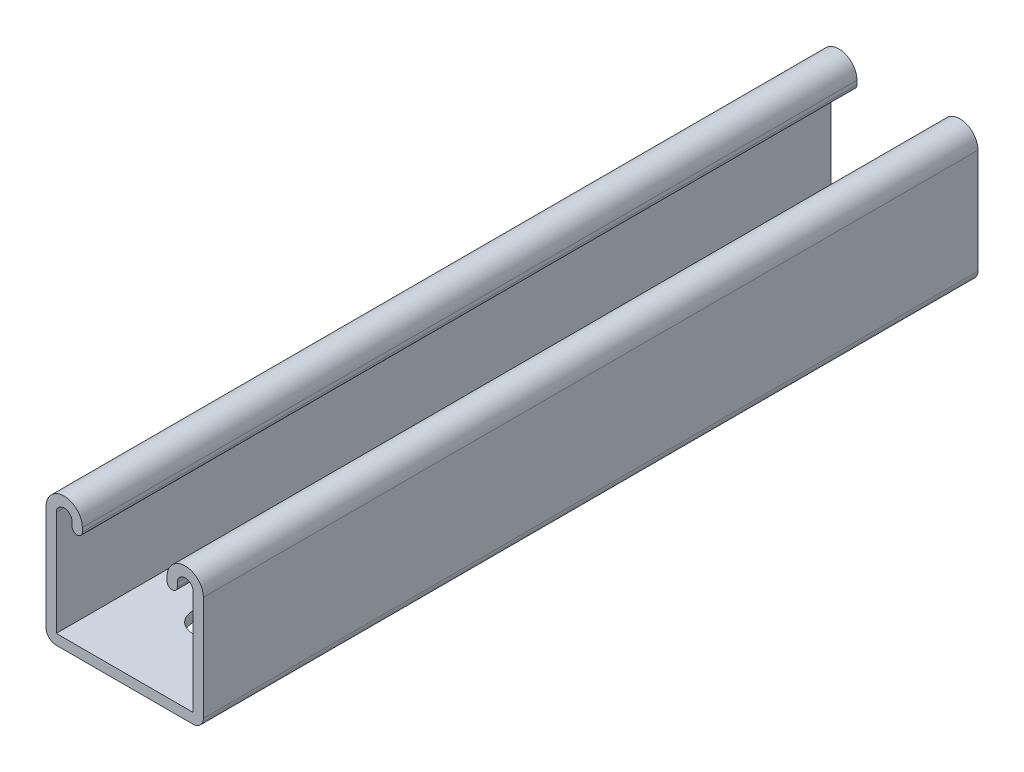
ISO-10303-21;
HEADER;
FILE_DESCRIPTION(('STEP AP214'),'2;1');
FILE_NAME('part.step','',(''),(''),'','','');
FILE_SCHEMA(('AUTOMOTIVE_DESIGN { 1 0 10303 214 1 1 1 1 }'));
ENDSEC;
DATA;
#1=APPLICATION_CONTEXT('core data for automotive mechanical design processes');
#2=APPLICATION_PROTOCOL_DEFINITION('international standard','automotive_design',2000,#1);
#3=PRODUCT_CONTEXT('',#1,'mechanical');
#4=PRODUCT('Part','Part','',(#3));
#5=PRODUCT_RELATED_PRODUCT_CATEGORY('part','',(#4));
#6=PRODUCT_DEFINITION_FORMATION('','',#4);
#7=PRODUCT_DEFINITION_CONTEXT('part definition',#1,'design');
#8=PRODUCT_DEFINITION('design','',#6,#7);
#9=PRODUCT_DEFINITION_SHAPE('','',#8);
#10=(LENGTH_UNIT() NAMED_UNIT(*) SI_UNIT(.MILLI.,.METRE.));
#11=(NAMED_UNIT(*) PLANE_ANGLE_UNIT() SI_UNIT($,.RADIAN.));
#12=(NAMED_UNIT(*) SI_UNIT($,.STERADIAN.) SOLID_ANGLE_UNIT());
#13=UNCERTAINTY_MEASURE_WITH_UNIT(LENGTH_MEASURE(1.E-05),#10,'distance_accuracy_value','');
#14=(GEOMETRIC_REPRESENTATION_CONTEXT(3) GLOBAL_UNCERTAINTY_ASSIGNED_CONTEXT((#13)) GLOBAL_UNIT_ASSIGNED_CONTEXT((#10,
#11,#12)) REPRESENTATION_CONTEXT('',''));
#15=CARTESIAN_POINT('',(0.,0.,0.));
#16=DIRECTION('',(0.,0.,1.));
#17=DIRECTION('',(1.,0.,0.));
#18=AXIS2_PLACEMENT_3D('',#15,#16,#17);
#19=CARTESIAN_POINT('',(-15.875,15.1511,203.2));
#20=DIRECTION('',(0.,0.,-1.));
#21=DIRECTION('',(-1.,0.,0.));
#22=AXIS2_PLACEMENT_3D('',#19,#20,#21);
#23=CYLINDRICAL_SURFACE('',#22,4.7625);
#24=CARTESIAN_POINT('',(-15.875,15.1511,0.));
#25=DIRECTION('',(0.,0.,1.));
#26=DIRECTION('',(-1.,0.,0.));
#27=AXIS2_PLACEMENT_3D('',#24,#25,#26);
#28=CIRCLE('',#27,4.7625);
#29=CARTESIAN_POINT('',(-11.1125,15.1511,0.));
#30=VERTEX_POINT('',#29);
#31=CARTESIAN_POINT('',(-20.6375,15.1511,0.));
#32=VERTEX_POINT('',#31);
#33=EDGE_CURVE('E253',#30,#32,#28,.T.);
#34=ORIENTED_EDGE('',*,*,#33,.T.);
#35=DIRECTION('',(0.,0.,-1.));
#36=VECTOR('',#35,1.);
#37=CARTESIAN_POINT('',(-20.6375,15.1511,203.2));
#38=LINE('',#37,#36);
#39=CARTESIAN_POINT('',(-20.6375,15.1511,203.2));
#40=VERTEX_POINT('',#39);
#41=EDGE_CURVE('E384',#40,#32,#38,.T.);
#42=ORIENTED_EDGE('',*,*,#41,.F.);
#43=CARTESIAN_POINT('',(-15.875,15.1511,203.2));
#44=DIRECTION('',(0.,0.,1.));
#45=DIRECTION('',(-1.,0.,0.));
#46=AXIS2_PLACEMENT_3D('',#43,#44,#45);
#47=CIRCLE('',#46,4.7625);
#48=CARTESIAN_POINT('',(-11.1125,15.1511,203.2));
#49=VERTEX_POINT('',#48);
#50=EDGE_CURVE('E260',#49,#40,#47,.T.);
#51=ORIENTED_EDGE('',*,*,#50,.F.);
#52=DIRECTION('',(0.,0.,-1.));
#53=VECTOR('',#52,1.);
#54=CARTESIAN_POINT('',(-11.1125,15.1511,203.2));
#55=LINE('',#54,#53);
#56=EDGE_CURVE('E298',#49,#30,#55,.T.);
#57=ORIENTED_EDGE('',*,*,#56,.T.);
#58=EDGE_LOOP('',(#34,#42,#51,#57));
#59=FACE_BOUND('',#58,.T.);
#60=ADVANCED_FACE('F32',(#59),#23,.T.);
#61=CARTESIAN_POINT('',(-20.6375,15.1511,203.2));
#62=DIRECTION('',(1.,0.,0.));
#63=DIRECTION('',(0.,1.,0.));
#64=AXIS2_PLACEMENT_3D('',#61,#62,#63);
#65=PLANE('',#64);
#66=DIRECTION('',(0.,-1.,0.));
#67=VECTOR('',#66,1.);
#68=CARTESIAN_POINT('',(-20.6375,15.1511,0.));
#69=LINE('',#68,#67);
#70=CARTESIAN_POINT('',(-20.6375,-12.319,0.));
#71=VERTEX_POINT('',#70);
#72=EDGE_CURVE('E301',#32,#71,#69,.T.);
#73=ORIENTED_EDGE('',*,*,#72,.T.);
#74=DIRECTION('',(0.,0.,-1.));
#75=VECTOR('',#74,1.);
#76=CARTESIAN_POINT('',(-20.6375,-12.319,203.2));
#77=LINE('',#76,#75);
#78=CARTESIAN_POINT('',(-20.6375,-12.319,203.2));
#79=VERTEX_POINT('',#78);
#80=EDGE_CURVE('E381',#79,#71,#77,.T.);
#81=ORIENTED_EDGE('',*,*,#80,.F.);
#82=DIRECTION('',(0.,-1.,0.));
#83=VECTOR('',#82,1.);
#84=CARTESIAN_POINT('',(-20.6375,15.1511,203.2));
#85=LINE('',#84,#83);
#86=EDGE_CURVE('E263',#40,#79,#85,.T.);
#87=ORIENTED_EDGE('',*,*,#86,.F.);
#88=ORIENTED_EDGE('',*,*,#41,.T.);
#89=EDGE_LOOP('',(#73,#81,#87,#88));
#90=FACE_BOUND('',#89,.T.);
#91=ADVANCED_FACE('F425',(#90),#65,.F.);
#92=CARTESIAN_POINT('',(-17.9451,-12.319,203.2));
#93=DIRECTION('',(0.,0.,-1.));
#94=DIRECTION('',(-1.,0.,0.));
#95=AXIS2_PLACEMENT_3D('',#92,#93,#94);
#96=CYLINDRICAL_SURFACE('',#95,2.6924);
#97=CARTESIAN_POINT('',(-17.9451,-12.319,0.));
#98=DIRECTION('',(0.,0.,1.));
#99=DIRECTION('',(-1.,0.,0.));
#100=AXIS2_PLACEMENT_3D('',#97,#98,#99);
#101=CIRCLE('',#100,2.6924);
#102=CARTESIAN_POINT('',(-17.9451,-15.0114,0.));
#103=VERTEX_POINT('',#102);
#104=EDGE_CURVE('E303',#71,#103,#101,.T.);
#105=ORIENTED_EDGE('',*,*,#104,.T.);
#106=DIRECTION('',(0.,0.,-1.));
#107=VECTOR('',#106,1.);
#108=CARTESIAN_POINT('',(-17.9451,-15.0114,203.2));
#109=LINE('',#108,#107);
#110=CARTESIAN_POINT('',(-17.9451,-15.0114,203.2));
#111=VERTEX_POINT('',#110);
#112=EDGE_CURVE('E378',#111,#103,#109,.T.);
#113=ORIENTED_EDGE('',*,*,#112,.F.);
#114=CARTESIAN_POINT('',(-17.9451,-12.319,203.2));
#115=DIRECTION('',(0.,0.,1.));
#116=DIRECTION('',(-1.,0.,0.));
#117=AXIS2_PLACEMENT_3D('',#114,#115,#116);
#118=CIRCLE('',#117,2.6924);
#119=EDGE_CURVE('E266',#79,#111,#118,.T.);
#120=ORIENTED_EDGE('',*,*,#119,.F.);
#121=ORIENTED_EDGE('',*,*,#80,.T.);
#122=EDGE_LOOP('',(#105,#113,#120,#121));
#123=FACE_BOUND('',#122,.T.);
#124=ADVANCED_FACE('F430',(#123),#96,.T.);
#125=CARTESIAN_POINT('',(-17.9451,-15.0114,203.2));
#126=DIRECTION('',(0.,1.,0.));
#127=DIRECTION('',(-1.,0.,0.));
#128=AXIS2_PLACEMENT_3D('',#125,#126,#127);
#129=PLANE('',#128);
#130=DIRECTION('',(0.,0.,-1.));
#131=VECTOR('',#130,1.);
#132=CARTESIAN_POINT('',(-5.159375,-15.0113999999917,114.3));
#133=LINE('',#132,#131);
#134=CARTESIAN_POINT('',(-5.15937500000001,-15.0114,180.18125));
#135=VERTEX_POINT('',#134);
#136=CARTESIAN_POINT('',(-5.159375,-15.0113999999917,114.3));
#137=VERTEX_POINT('',#136);
#138=EDGE_CURVE('E206',#135,#137,#133,.T.);
#139=ORIENTED_EDGE('',*,*,#138,.F.);
#140=CARTESIAN_POINT('',(0.,-15.0113999999917,180.18125));
#141=DIRECTION('',(0.,-1.,0.));
#142=DIRECTION('',(1.,0.,0.));
#143=AXIS2_PLACEMENT_3D('',#140,#141,#142);
#144=CIRCLE('',#143,5.159375);
#145=CARTESIAN_POINT('',(5.159375,-15.0113999999917,180.18125));
#146=VERTEX_POINT('',#145);
#147=EDGE_CURVE('E46',#146,#135,#144,.T.);
#148=ORIENTED_EDGE('',*,*,#147,.F.);
#149=DIRECTION('',(0.,0.,1.));
#150=VECTOR('',#149,1.);
#151=CARTESIAN_POINT('',(5.159375,-15.0113999999917,180.18125));
#152=LINE('',#151,#150);
#153=CARTESIAN_POINT('',(5.159375,-15.0113999999917,114.3));
#154=VERTEX_POINT('',#153);
#155=EDGE_CURVE('E222',#154,#146,#152,.T.);
#156=ORIENTED_EDGE('',*,*,#155,.F.);
#157=CARTESIAN_POINT('',(0.,-15.0113999999917,114.3));
#158=DIRECTION('',(0.,-1.,0.));
#159=DIRECTION('',(1.,0.,0.));
#160=AXIS2_PLACEMENT_3D('',#157,#158,#159);
#161=CIRCLE('',#160,5.159375);
#162=EDGE_CURVE('E216',#137,#154,#161,.T.);
#163=ORIENTED_EDGE('',*,*,#162,.F.);
#164=EDGE_LOOP('',(#139,#148,#156,#163));
#165=FACE_BOUND('',#164,.T.);
#166=DIRECTION('',(0.,0.,-1.));
#167=VECTOR('',#166,1.);
#168=CARTESIAN_POINT('',(-5.159375,-15.0113999999917,12.7));
#169=LINE('',#168,#167);
#170=CARTESIAN_POINT('',(-5.15937500000001,-15.0114,78.58125));
#171=VERTEX_POINT('',#170);
#172=CARTESIAN_POINT('',(-5.159375,-15.0113999999917,12.7));
#173=VERTEX_POINT('',#172);
#174=EDGE_CURVE('E241',#171,#173,#169,.T.);
#175=ORIENTED_EDGE('',*,*,#174,.F.);
#176=CARTESIAN_POINT('',(0.,-15.0113999999917,78.58125));
#177=DIRECTION('',(0.,-1.,0.));
#178=DIRECTION('',(1.,0.,0.));
#179=AXIS2_PLACEMENT_3D('',#176,#177,#178);
#180=CIRCLE('',#179,5.159375);
#181=CARTESIAN_POINT('',(5.159375,-15.0113999999917,78.58125));
#182=VERTEX_POINT('',#181);
#183=EDGE_CURVE('E239',#182,#171,#180,.T.);
#184=ORIENTED_EDGE('',*,*,#183,.F.);
#185=DIRECTION('',(0.,0.,1.));
#186=VECTOR('',#185,1.);
#187=CARTESIAN_POINT('',(5.159375,-15.0113999999917,78.58125));
#188=LINE('',#187,#186);
#189=CARTESIAN_POINT('',(5.159375,-15.0113999999917,12.7));
#190=VERTEX_POINT('',#189);
#191=EDGE_CURVE('E247',#190,#182,#188,.T.);
#192=ORIENTED_EDGE('',*,*,#191,.F.);
#193=CARTESIAN_POINT('',(0.,-15.0113999999917,12.7));
#194=DIRECTION('',(0.,-1.,0.));
#195=DIRECTION('',(1.,0.,0.));
#196=AXIS2_PLACEMENT_3D('',#193,#194,#195);
#197=CIRCLE('',#196,5.159375);
#198=EDGE_CURVE('E244',#173,#190,#197,.T.);
#199=ORIENTED_EDGE('',*,*,#198,.F.);
#200=EDGE_LOOP('',(#175,#184,#192,#199));
#201=FACE_BOUND('',#200,.T.);
#202=DIRECTION('',(1.,0.,0.));
#203=VECTOR('',#202,1.);
#204=CARTESIAN_POINT('',(-17.9451,-15.0114,0.));
#205=LINE('',#204,#203);
#206=CARTESIAN_POINT('',(17.9451,-15.0114,0.));
#207=VERTEX_POINT('',#206);
#208=EDGE_CURVE('E305',#103,#207,#205,.T.);
#209=ORIENTED_EDGE('',*,*,#208,.T.);
#210=DIRECTION('',(0.,0.,-1.));
#211=VECTOR('',#210,1.);
#212=CARTESIAN_POINT('',(17.9451,-15.0114,203.2));
#213=LINE('',#212,#211);
#214=CARTESIAN_POINT('',(17.9451,-15.0114,203.2));
#215=VERTEX_POINT('',#214);
#216=EDGE_CURVE('E375',#215,#207,#213,.T.);
#217=ORIENTED_EDGE('',*,*,#216,.F.);
#218=DIRECTION('',(1.,0.,0.));
#219=VECTOR('',#218,1.);
#220=CARTESIAN_POINT('',(-17.9451,-15.0114,203.2));
#221=LINE('',#220,#219);
#222=EDGE_CURVE('E268',#111,#215,#221,.T.);
#223=ORIENTED_EDGE('',*,*,#222,.F.);
#224=ORIENTED_EDGE('',*,*,#112,.T.);
#225=EDGE_LOOP('',(#209,#217,#223,#224));
#226=FACE_BOUND('',#225,.T.);
#227=ADVANCED_FACE('F220',(#165,#201,#226),#129,.F.);
#228=CARTESIAN_POINT('',(17.9451,-12.319,203.2));
#229=DIRECTION('',(0.,0.,-1.));
#230=DIRECTION('',(-1.,0.,0.));
#231=AXIS2_PLACEMENT_3D('',#228,#229,#230);
#232=CYLINDRICAL_SURFACE('',#231,2.6924);
#233=CARTESIAN_POINT('',(17.9451,-12.319,0.));
#234=DIRECTION('',(0.,0.,1.));
#235=DIRECTION('',(1.,0.,0.));
#236=AXIS2_PLACEMENT_3D('',#233,#234,#235);
#237=CIRCLE('',#236,2.6924);
#238=CARTESIAN_POINT('',(20.6375,-12.319,0.));
#239=VERTEX_POINT('',#238);
#240=EDGE_CURVE('E307',#207,#239,#237,.T.);
#241=ORIENTED_EDGE('',*,*,#240,.T.);
#242=DIRECTION('',(0.,0.,-1.));
#243=VECTOR('',#242,1.);
#244=CARTESIAN_POINT('',(20.6375,-12.319,203.2));
#245=LINE('',#244,#243);
#246=CARTESIAN_POINT('',(20.6375,-12.319,203.2));
#247=VERTEX_POINT('',#246);
#248=EDGE_CURVE('E372',#247,#239,#245,.T.);
#249=ORIENTED_EDGE('',*,*,#248,.F.);
#250=CARTESIAN_POINT('',(17.9451,-12.319,203.2));
#251=DIRECTION('',(0.,0.,1.));
#252=DIRECTION('',(1.,0.,0.));
#253=AXIS2_PLACEMENT_3D('',#250,#251,#252);
#254=CIRCLE('',#253,2.6924);
#255=EDGE_CURVE('E270',#215,#247,#254,.T.);
#256=ORIENTED_EDGE('',*,*,#255,.F.);
#257=ORIENTED_EDGE('',*,*,#216,.T.);
#258=EDGE_LOOP('',(#241,#249,#256,#257));
#259=FACE_BOUND('',#258,.T.);
#260=ADVANCED_FACE('F510',(#259),#232,.T.);
#261=CARTESIAN_POINT('',(20.6375,-12.319,203.2));
#262=DIRECTION('',(-1.,0.,0.));
#263=DIRECTION('',(0.,0.,1.));
#264=AXIS2_PLACEMENT_3D('',#261,#262,#263);
#265=PLANE('',#264);
#266=DIRECTION('',(0.,1.,0.));
#267=VECTOR('',#266,1.);
#268=CARTESIAN_POINT('',(20.6375,-12.319,0.));
#269=LINE('',#268,#267);
#270=CARTESIAN_POINT('',(20.6375,15.1511,0.));
#271=VERTEX_POINT('',#270);
#272=EDGE_CURVE('E309',#239,#271,#269,.T.);
#273=ORIENTED_EDGE('',*,*,#272,.T.);
#274=DIRECTION('',(0.,0.,-1.));
#275=VECTOR('',#274,1.);
#276=CARTESIAN_POINT('',(20.6375,15.1511,203.2));
#277=LINE('',#276,#275);
#278=CARTESIAN_POINT('',(20.6375,15.1511,203.2));
#279=VERTEX_POINT('',#278);
#280=EDGE_CURVE('E369',#279,#271,#277,.T.);
#281=ORIENTED_EDGE('',*,*,#280,.F.);
#282=DIRECTION('',(0.,1.,0.));
#283=VECTOR('',#282,1.);
#284=CARTESIAN_POINT('',(20.6375,-12.319,203.2));
#285=LINE('',#284,#283);
#286=EDGE_CURVE('E272',#247,#279,#285,.T.);
#287=ORIENTED_EDGE('',*,*,#286,.F.);
#288=ORIENTED_EDGE('',*,*,#248,.T.);
#289=EDGE_LOOP('',(#273,#281,#287,#288));
#290=FACE_BOUND('',#289,.T.);
#291=ADVANCED_FACE('F506',(#290),#265,.F.);
#292=CARTESIAN_POINT('',(15.875,15.1511,203.2));
#293=DIRECTION('',(0.,0.,-1.));
#294=DIRECTION('',(-1.,0.,0.));
#295=AXIS2_PLACEMENT_3D('',#292,#293,#294);
#296=CYLINDRICAL_SURFACE('',#295,4.7625);
#297=CARTESIAN_POINT('',(15.875,15.1511,0.));
#298=DIRECTION('',(0.,0.,1.));
#299=DIRECTION('',(1.,0.,0.));
#300=AXIS2_PLACEMENT_3D('',#297,#298,#299);
#301=CIRCLE('',#300,4.7625);
#302=CARTESIAN_POINT('',(11.1125,15.1511,0.));
#303=VERTEX_POINT('',#302);
#304=EDGE_CURVE('E311',#271,#303,#301,.T.);
#305=ORIENTED_EDGE('',*,*,#304,.T.);
#306=DIRECTION('',(0.,0.,-1.));
#307=VECTOR('',#306,1.);
#308=CARTESIAN_POINT('',(11.1125,15.1511,203.2));
#309=LINE('',#308,#307);
#310=CARTESIAN_POINT('',(11.1125,15.1511,203.2));
#311=VERTEX_POINT('',#310);
#312=EDGE_CURVE('E366',#311,#303,#309,.T.);
#313=ORIENTED_EDGE('',*,*,#312,.F.);
#314=CARTESIAN_POINT('',(15.875,15.1511,203.2));
#315=DIRECTION('',(0.,0.,1.));
#316=DIRECTION('',(1.,0.,0.));
#317=AXIS2_PLACEMENT_3D('',#314,#315,#316);
#318=CIRCLE('',#317,4.7625);
#319=EDGE_CURVE('E274',#279,#311,#318,.T.);
#320=ORIENTED_EDGE('',*,*,#319,.F.);
#321=ORIENTED_EDGE('',*,*,#280,.T.);
#322=EDGE_LOOP('',(#305,#313,#320,#321));
#323=FACE_BOUND('',#322,.T.);
#324=ADVANCED_FACE('F501',(#323),#296,.T.);
#325=CARTESIAN_POINT('',(11.1125,15.1511,203.2));
#326=DIRECTION('',(1.,0.,0.));
#327=DIRECTION('',(0.,1.,0.));
#328=AXIS2_PLACEMENT_3D('',#325,#326,#327);
#329=PLANE('',#328);
#330=DIRECTION('',(0.,-1.,0.));
#331=VECTOR('',#330,1.);
#332=CARTESIAN_POINT('',(11.1125,15.1511,0.));
#333=LINE('',#332,#331);
#334=CARTESIAN_POINT('',(11.1125,14.11605,0.));
#335=VERTEX_POINT('',#334);
#336=EDGE_CURVE('E313',#303,#335,#333,.T.);
#337=ORIENTED_EDGE('',*,*,#336,.T.);
#338=DIRECTION('',(0.,0.,-1.));
#339=VECTOR('',#338,1.);
#340=CARTESIAN_POINT('',(11.1125,14.11605,203.2));
#341=LINE('',#340,#339);
#342=CARTESIAN_POINT('',(11.1125,14.11605,203.2));
#343=VERTEX_POINT('',#342);
#344=EDGE_CURVE('E363',#343,#335,#341,.T.);
#345=ORIENTED_EDGE('',*,*,#344,.F.);
#346=DIRECTION('',(0.,-1.,0.));
#347=VECTOR('',#346,1.);
#348=CARTESIAN_POINT('',(11.1125,15.1511,203.2));
#349=LINE('',#348,#347);
#350=EDGE_CURVE('E276',#311,#343,#349,.T.);
#351=ORIENTED_EDGE('',*,*,#350,.F.);
#352=ORIENTED_EDGE('',*,*,#312,.T.);
#353=EDGE_LOOP('',(#337,#345,#351,#352));
#354=FACE_BOUND('',#353,.T.);
#355=ADVANCED_FACE('F495',(#354),#329,.F.);
#356=CARTESIAN_POINT('',(12.4587,14.11605,203.2));
#357=DIRECTION('',(0.,0.,-1.));
#358=DIRECTION('',(-1.,0.,0.));
#359=AXIS2_PLACEMENT_3D('',#356,#357,#358);
#360=CYLINDRICAL_SURFACE('',#359,1.3462);
#361=CARTESIAN_POINT('',(12.4587,14.11605,0.));
#362=DIRECTION('',(0.,0.,1.));
#363=DIRECTION('',(1.,0.,0.));
#364=AXIS2_PLACEMENT_3D('',#361,#362,#363);
#365=CIRCLE('',#364,1.3462);
#366=CARTESIAN_POINT('',(13.8049,14.11605,0.));
#367=VERTEX_POINT('',#366);
#368=EDGE_CURVE('E315',#335,#367,#365,.T.);
#369=ORIENTED_EDGE('',*,*,#368,.T.);
#370=DIRECTION('',(0.,0.,-1.));
#371=VECTOR('',#370,1.);
#372=CARTESIAN_POINT('',(13.8049,14.11605,203.2));
#373=LINE('',#372,#371);
#374=CARTESIAN_POINT('',(13.8049,14.11605,203.2));
#375=VERTEX_POINT('',#374);
#376=EDGE_CURVE('E360',#375,#367,#373,.T.);
#377=ORIENTED_EDGE('',*,*,#376,.F.);
#378=CARTESIAN_POINT('',(12.4587,14.11605,203.2));
#379=DIRECTION('',(0.,0.,1.));
#380=DIRECTION('',(1.,0.,0.));
#381=AXIS2_PLACEMENT_3D('',#378,#379,#380);
#382=CIRCLE('',#381,1.3462);
#383=EDGE_CURVE('E278',#343,#375,#382,.T.);
#384=ORIENTED_EDGE('',*,*,#383,.F.);
#385=ORIENTED_EDGE('',*,*,#344,.T.);
#386=EDGE_LOOP('',(#369,#377,#384,#385));
#387=FACE_BOUND('',#386,.T.);
#388=ADVANCED_FACE('F491',(#387),#360,.T.);
#389=CARTESIAN_POINT('',(13.8049,15.1511,203.2));
#390=DIRECTION('',(-1.,0.,0.));
#391=DIRECTION('',(0.,0.,1.));
#392=AXIS2_PLACEMENT_3D('',#389,#390,#391);
#393=PLANE('',#392);
#394=DIRECTION('',(0.,1.,0.));
#395=VECTOR('',#394,1.);
#396=CARTESIAN_POINT('',(13.8049,15.1511,0.));
#397=LINE('',#396,#395);
#398=CARTESIAN_POINT('',(13.8049,15.1511,0.));
#399=VERTEX_POINT('',#398);
#400=EDGE_CURVE('E317',#367,#399,#397,.T.);
#401=ORIENTED_EDGE('',*,*,#400,.T.);
#402=DIRECTION('',(0.,0.,-1.));
#403=VECTOR('',#402,1.);
#404=CARTESIAN_POINT('',(13.8049,15.1511,203.2));
#405=LINE('',#404,#403);
#406=CARTESIAN_POINT('',(13.8049,15.1511,203.2));
#407=VERTEX_POINT('',#406);
#408=EDGE_CURVE('E357',#407,#399,#405,.T.);
#409=ORIENTED_EDGE('',*,*,#408,.F.);
#410=DIRECTION('',(0.,1.,0.));
#411=VECTOR('',#410,1.);
#412=CARTESIAN_POINT('',(13.8049,15.1511,203.2));
#413=LINE('',#412,#411);
#414=EDGE_CURVE('E280',#375,#407,#413,.T.);
#415=ORIENTED_EDGE('',*,*,#414,.F.);
#416=ORIENTED_EDGE('',*,*,#376,.T.);
#417=EDGE_LOOP('',(#401,#409,#415,#416));
#418=FACE_BOUND('',#417,.T.);
#419=ADVANCED_FACE('F486',(#418),#393,.F.);
#420=CARTESIAN_POINT('',(15.875,15.1511,203.2));
#421=DIRECTION('',(0.,0.,-1.));
#422=DIRECTION('',(-1.,0.,0.));
#423=AXIS2_PLACEMENT_3D('',#420,#421,#422);
#424=CYLINDRICAL_SURFACE('',#423,2.0701);
#425=CARTESIAN_POINT('',(15.875,15.1511,0.));
#426=DIRECTION('',(0.,0.,-1.));
#427=DIRECTION('',(1.,0.,0.));
#428=AXIS2_PLACEMENT_3D('',#425,#426,#427);
#429=CIRCLE('',#428,2.0701);
#430=CARTESIAN_POINT('',(17.9451,15.1511,0.));
#431=VERTEX_POINT('',#430);
#432=EDGE_CURVE('E319',#399,#431,#429,.T.);
#433=ORIENTED_EDGE('',*,*,#432,.T.);
#434=DIRECTION('',(0.,0.,-1.));
#435=VECTOR('',#434,1.);
#436=CARTESIAN_POINT('',(17.9451,15.1511,203.2));
#437=LINE('',#436,#435);
#438=CARTESIAN_POINT('',(17.9451,15.1511,203.2));
#439=VERTEX_POINT('',#438);
#440=EDGE_CURVE('E354',#439,#431,#437,.T.);
#441=ORIENTED_EDGE('',*,*,#440,.F.);
#442=CARTESIAN_POINT('',(15.875,15.1511,203.2));
#443=DIRECTION('',(0.,0.,-1.));
#444=DIRECTION('',(1.,0.,0.));
#445=AXIS2_PLACEMENT_3D('',#442,#443,#444);
#446=CIRCLE('',#445,2.0701);
#447=EDGE_CURVE('E282',#407,#439,#446,.T.);
#448=ORIENTED_EDGE('',*,*,#447,.F.);
#449=ORIENTED_EDGE('',*,*,#408,.T.);
#450=EDGE_LOOP('',(#433,#441,#448,#449));
#451=FACE_BOUND('',#450,.T.);
#452=ADVANCED_FACE('F480',(#451),#424,.F.);
#453=CARTESIAN_POINT('',(17.9451,-12.319,203.2));
#454=DIRECTION('',(1.,0.,0.));
#455=DIRECTION('',(0.,1.,0.));
#456=AXIS2_PLACEMENT_3D('',#453,#454,#455);
#457=PLANE('',#456);
#458=DIRECTION('',(0.,-1.,0.));
#459=VECTOR('',#458,1.);
#460=CARTESIAN_POINT('',(17.9451,-12.319,0.));
#461=LINE('',#460,#459);
#462=CARTESIAN_POINT('',(17.9451,-12.319,0.));
#463=VERTEX_POINT('',#462);
#464=EDGE_CURVE('E321',#431,#463,#461,.T.);
#465=ORIENTED_EDGE('',*,*,#464,.T.);
#466=DIRECTION('',(0.,0.,-1.));
#467=VECTOR('',#466,1.);
#468=CARTESIAN_POINT('',(17.9451,-12.319,203.2));
#469=LINE('',#468,#467);
#470=CARTESIAN_POINT('',(17.9451,-12.319,203.2));
#471=VERTEX_POINT('',#470);
#472=EDGE_CURVE('E351',#471,#463,#469,.T.);
#473=ORIENTED_EDGE('',*,*,#472,.F.);
#474=DIRECTION('',(0.,-1.,0.));
#475=VECTOR('',#474,1.);
#476=CARTESIAN_POINT('',(17.9451,-12.319,203.2));
#477=LINE('',#476,#475);
#478=EDGE_CURVE('E284',#439,#471,#477,.T.);
#479=ORIENTED_EDGE('',*,*,#478,.F.);
#480=ORIENTED_EDGE('',*,*,#440,.T.);
#481=EDGE_LOOP('',(#465,#473,#479,#480));
#482=FACE_BOUND('',#481,.T.);
#483=ADVANCED_FACE('F476',(#482),#457,.F.);
#484=CARTESIAN_POINT('',(-17.9451,-12.319,203.2));
#485=DIRECTION('',(0.,-1.,0.));
#486=DIRECTION('',(0.,0.,-1.));
#487=AXIS2_PLACEMENT_3D('',#484,#485,#486);
#488=PLANE('',#487);
#489=DIRECTION('',(0.,0.,1.));
#490=VECTOR('',#489,1.);
#491=CARTESIAN_POINT('',(5.15937499999999,-12.319,304.8));
#492=LINE('',#491,#490);
#493=CARTESIAN_POINT('',(5.159375,-12.319,114.3));
#494=VERTEX_POINT('',#493);
#495=CARTESIAN_POINT('',(5.159375,-12.319,180.18125));
#496=VERTEX_POINT('',#495);
#497=EDGE_CURVE('E232',#494,#496,#492,.T.);
#498=ORIENTED_EDGE('',*,*,#497,.T.);
#499=CARTESIAN_POINT('',(0.,-12.319,180.18125));
#500=DIRECTION('',(0.,-1.,0.));
#501=DIRECTION('',(0.,0.,-1.));
#502=AXIS2_PLACEMENT_3D('',#499,#500,#501);
#503=CIRCLE('',#502,5.159375);
#504=CARTESIAN_POINT('',(-5.15937500000001,-12.319,180.18125));
#505=VERTEX_POINT('',#504);
#506=EDGE_CURVE('E236',#496,#505,#503,.T.);
#507=ORIENTED_EDGE('',*,*,#506,.T.);
#508=DIRECTION('',(0.,0.,-1.));
#509=VECTOR('',#508,1.);
#510=CARTESIAN_POINT('',(-5.15937500000002,-12.319,304.8));
#511=LINE('',#510,#509);
#512=CARTESIAN_POINT('',(-5.159375,-12.319,114.3));
#513=VERTEX_POINT('',#512);
#514=EDGE_CURVE('E213',#505,#513,#511,.T.);
#515=ORIENTED_EDGE('',*,*,#514,.T.);
#516=CARTESIAN_POINT('',(0.,-12.319,114.3));
#517=DIRECTION('',(0.,-1.,0.));
#518=DIRECTION('',(0.,0.,-1.));
#519=AXIS2_PLACEMENT_3D('',#516,#517,#518);
#520=CIRCLE('',#519,5.159375);
#521=EDGE_CURVE('E54',#513,#494,#520,.T.);
#522=ORIENTED_EDGE('',*,*,#521,.T.);
#523=EDGE_LOOP('',(#498,#507,#515,#522));
#524=FACE_BOUND('',#523,.T.);
#525=DIRECTION('',(0.,0.,1.));
#526=VECTOR('',#525,1.);
#527=CARTESIAN_POINT('',(5.15937499999999,-12.319,203.2));
#528=LINE('',#527,#526);
#529=CARTESIAN_POINT('',(5.159375,-12.319,12.7));
#530=VERTEX_POINT('',#529);
#531=CARTESIAN_POINT('',(5.159375,-12.319,78.58125));
#532=VERTEX_POINT('',#531);
#533=EDGE_CURVE('E39',#530,#532,#528,.T.);
#534=ORIENTED_EDGE('',*,*,#533,.T.);
#535=CARTESIAN_POINT('',(0.,-12.319,78.58125));
#536=DIRECTION('',(0.,-1.,0.));
#537=DIRECTION('',(0.,0.,-1.));
#538=AXIS2_PLACEMENT_3D('',#535,#536,#537);
#539=CIRCLE('',#538,5.159375);
#540=CARTESIAN_POINT('',(-5.15937500000001,-12.319,78.58125));
#541=VERTEX_POINT('',#540);
#542=EDGE_CURVE('E11',#532,#541,#539,.T.);
#543=ORIENTED_EDGE('',*,*,#542,.T.);
#544=DIRECTION('',(0.,0.,-1.));
#545=VECTOR('',#544,1.);
#546=CARTESIAN_POINT('',(-5.15937500000002,-12.319,203.2));
#547=LINE('',#546,#545);
#548=CARTESIAN_POINT('',(-5.159375,-12.319,12.7));
#549=VERTEX_POINT('',#548);
#550=EDGE_CURVE('E387',#541,#549,#547,.T.);
#551=ORIENTED_EDGE('',*,*,#550,.T.);
#552=CARTESIAN_POINT('',(0.,-12.319,12.7));
#553=DIRECTION('',(0.,-1.,0.));
#554=DIRECTION('',(0.,0.,-1.));
#555=AXIS2_PLACEMENT_3D('',#552,#553,#554);
#556=CIRCLE('',#555,5.159375);
#557=EDGE_CURVE('E390',#549,#530,#556,.T.);
#558=ORIENTED_EDGE('',*,*,#557,.T.);
#559=EDGE_LOOP('',(#534,#543,#551,#558));
#560=FACE_BOUND('',#559,.T.);
#561=DIRECTION('',(-1.,0.,0.));
#562=VECTOR('',#561,1.);
#563=CARTESIAN_POINT('',(-17.9451,-12.319,0.));
#564=LINE('',#563,#562);
#565=CARTESIAN_POINT('',(-17.9451,-12.319,0.));
#566=VERTEX_POINT('',#565);
#567=EDGE_CURVE('E323',#463,#566,#564,.T.);
#568=ORIENTED_EDGE('',*,*,#567,.T.);
#569=DIRECTION('',(0.,0.,-1.));
#570=VECTOR('',#569,1.);
#571=CARTESIAN_POINT('',(-17.9451,-12.319,203.2));
#572=LINE('',#571,#570);
#573=CARTESIAN_POINT('',(-17.9451,-12.319,203.2));
#574=VERTEX_POINT('',#573);
#575=EDGE_CURVE('E348',#574,#566,#572,.T.);
#576=ORIENTED_EDGE('',*,*,#575,.F.);
#577=DIRECTION('',(-1.,0.,0.));
#578=VECTOR('',#577,1.);
#579=CARTESIAN_POINT('',(-17.9451,-12.319,203.2));
#580=LINE('',#579,#578);
#581=EDGE_CURVE('E286',#471,#574,#580,.T.);
#582=ORIENTED_EDGE('',*,*,#581,.F.);
#583=ORIENTED_EDGE('',*,*,#472,.T.);
#584=EDGE_LOOP('',(#568,#576,#582,#583));
#585=FACE_BOUND('',#584,.T.);
#586=ADVANCED_FACE('F394',(#524,#560,#585),#488,.F.);
#587=CARTESIAN_POINT('',(-17.9451,15.1511,203.2));
#588=DIRECTION('',(-1.,0.,0.));
#589=DIRECTION('',(0.,0.,1.));
#590=AXIS2_PLACEMENT_3D('',#587,#588,#589);
#591=PLANE('',#590);
#592=DIRECTION('',(0.,1.,0.));
#593=VECTOR('',#592,1.);
#594=CARTESIAN_POINT('',(-17.9451,15.1511,0.));
#595=LINE('',#594,#593);
#596=CARTESIAN_POINT('',(-17.9451,15.1511,0.));
#597=VERTEX_POINT('',#596);
#598=EDGE_CURVE('E325',#566,#597,#595,.T.);
#599=ORIENTED_EDGE('',*,*,#598,.T.);
#600=DIRECTION('',(0.,0.,-1.));
#601=VECTOR('',#600,1.);
#602=CARTESIAN_POINT('',(-17.9451,15.1511,203.2));
#603=LINE('',#602,#601);
#604=CARTESIAN_POINT('',(-17.9451,15.1511,203.2));
#605=VERTEX_POINT('',#604);
#606=EDGE_CURVE('E345',#605,#597,#603,.T.);
#607=ORIENTED_EDGE('',*,*,#606,.F.);
#608=DIRECTION('',(0.,1.,0.));
#609=VECTOR('',#608,1.);
#610=CARTESIAN_POINT('',(-17.9451,15.1511,203.2));
#611=LINE('',#610,#609);
#612=EDGE_CURVE('E288',#574,#605,#611,.T.);
#613=ORIENTED_EDGE('',*,*,#612,.F.);
#614=ORIENTED_EDGE('',*,*,#575,.T.);
#615=EDGE_LOOP('',(#599,#607,#613,#614));
#616=FACE_BOUND('',#615,.T.);
#617=ADVANCED_FACE('F467',(#616),#591,.F.);
#618=CARTESIAN_POINT('',(-15.875,15.1511,203.2));
#619=DIRECTION('',(0.,0.,-1.));
#620=DIRECTION('',(-1.,0.,0.));
#621=AXIS2_PLACEMENT_3D('',#618,#619,#620);
#622=CYLINDRICAL_SURFACE('',#621,2.0701);
#623=CARTESIAN_POINT('',(-15.875,15.1511,0.));
#624=DIRECTION('',(0.,0.,-1.));
#625=DIRECTION('',(-1.,0.,0.));
#626=AXIS2_PLACEMENT_3D('',#623,#624,#625);
#627=CIRCLE('',#626,2.0701);
#628=CARTESIAN_POINT('',(-13.8049,15.1511,0.));
#629=VERTEX_POINT('',#628);
#630=EDGE_CURVE('E327',#597,#629,#627,.T.);
#631=ORIENTED_EDGE('',*,*,#630,.T.);
#632=DIRECTION('',(0.,0.,-1.));
#633=VECTOR('',#632,1.);
#634=CARTESIAN_POINT('',(-13.8049,15.1511,203.2));
#635=LINE('',#634,#633);
#636=CARTESIAN_POINT('',(-13.8049,15.1511,203.2));
#637=VERTEX_POINT('',#636);
#638=EDGE_CURVE('E342',#637,#629,#635,.T.);
#639=ORIENTED_EDGE('',*,*,#638,.F.);
#640=CARTESIAN_POINT('',(-15.875,15.1511,203.2));
#641=DIRECTION('',(0.,0.,-1.));
#642=DIRECTION('',(-1.,0.,0.));
#643=AXIS2_PLACEMENT_3D('',#640,#641,#642);
#644=CIRCLE('',#643,2.0701);
#645=EDGE_CURVE('E290',#605,#637,#644,.T.);
#646=ORIENTED_EDGE('',*,*,#645,.F.);
#647=ORIENTED_EDGE('',*,*,#606,.T.);
#648=EDGE_LOOP('',(#631,#639,#646,#647));
#649=FACE_BOUND('',#648,.T.);
#650=ADVANCED_FACE('F463',(#649),#622,.F.);
#651=CARTESIAN_POINT('',(-13.8049,15.1511,203.2));
#652=DIRECTION('',(1.,0.,0.));
#653=DIRECTION('',(0.,1.,0.));
#654=AXIS2_PLACEMENT_3D('',#651,#652,#653);
#655=PLANE('',#654);
#656=DIRECTION('',(0.,-1.,0.));
#657=VECTOR('',#656,1.);
#658=CARTESIAN_POINT('',(-13.8049,15.1511,0.));
#659=LINE('',#658,#657);
#660=CARTESIAN_POINT('',(-13.8049,14.11605,0.));
#661=VERTEX_POINT('',#660);
#662=EDGE_CURVE('E329',#629,#661,#659,.T.);
#663=ORIENTED_EDGE('',*,*,#662,.T.);
#664=DIRECTION('',(0.,0.,-1.));
#665=VECTOR('',#664,1.);
#666=CARTESIAN_POINT('',(-13.8049,14.11605,203.2));
#667=LINE('',#666,#665);
#668=CARTESIAN_POINT('',(-13.8049,14.11605,203.2));
#669=VERTEX_POINT('',#668);
#670=EDGE_CURVE('E339',#669,#661,#667,.T.);
#671=ORIENTED_EDGE('',*,*,#670,.F.);
#672=DIRECTION('',(0.,-1.,0.));
#673=VECTOR('',#672,1.);
#674=CARTESIAN_POINT('',(-13.8049,15.1511,203.2));
#675=LINE('',#674,#673);
#676=EDGE_CURVE('E292',#637,#669,#675,.T.);
#677=ORIENTED_EDGE('',*,*,#676,.F.);
#678=ORIENTED_EDGE('',*,*,#638,.T.);
#679=EDGE_LOOP('',(#663,#671,#677,#678));
#680=FACE_BOUND('',#679,.T.);
#681=ADVANCED_FACE('F458',(#680),#655,.F.);
#682=CARTESIAN_POINT('',(-12.4587,14.11605,203.2));
#683=DIRECTION('',(0.,0.,-1.));
#684=DIRECTION('',(-1.,0.,0.));
#685=AXIS2_PLACEMENT_3D('',#682,#683,#684);
#686=CYLINDRICAL_SURFACE('',#685,1.3462);
#687=CARTESIAN_POINT('',(-12.4587,14.11605,0.));
#688=DIRECTION('',(0.,0.,1.));
#689=DIRECTION('',(-1.,0.,0.));
#690=AXIS2_PLACEMENT_3D('',#687,#688,#689);
#691=CIRCLE('',#690,1.3462);
#692=CARTESIAN_POINT('',(-11.1125,14.11605,0.));
#693=VERTEX_POINT('',#692);
#694=EDGE_CURVE('E331',#661,#693,#691,.T.);
#695=ORIENTED_EDGE('',*,*,#694,.T.);
#696=DIRECTION('',(0.,0.,-1.));
#697=VECTOR('',#696,1.);
#698=CARTESIAN_POINT('',(-11.1125,14.11605,203.2));
#699=LINE('',#698,#697);
#700=CARTESIAN_POINT('',(-11.1125,14.11605,203.2));
#701=VERTEX_POINT('',#700);
#702=EDGE_CURVE('E336',#701,#693,#699,.T.);
#703=ORIENTED_EDGE('',*,*,#702,.F.);
#704=CARTESIAN_POINT('',(-12.4587,14.11605,203.2));
#705=DIRECTION('',(0.,0.,1.));
#706=DIRECTION('',(-1.,0.,0.));
#707=AXIS2_PLACEMENT_3D('',#704,#705,#706);
#708=CIRCLE('',#707,1.3462);
#709=EDGE_CURVE('E294',#669,#701,#708,.T.);
#710=ORIENTED_EDGE('',*,*,#709,.F.);
#711=ORIENTED_EDGE('',*,*,#670,.T.);
#712=EDGE_LOOP('',(#695,#703,#710,#711));
#713=FACE_BOUND('',#712,.T.);
#714=ADVANCED_FACE('F452',(#713),#686,.T.);
#715=CARTESIAN_POINT('',(-11.1125,15.1511,203.2));
#716=DIRECTION('',(-1.,0.,0.));
#717=DIRECTION('',(0.,0.,1.));
#718=AXIS2_PLACEMENT_3D('',#715,#716,#717);
#719=PLANE('',#718);
#720=DIRECTION('',(0.,1.,0.));
#721=VECTOR('',#720,1.);
#722=CARTESIAN_POINT('',(-11.1125,15.1511,0.));
#723=LINE('',#722,#721);
#724=EDGE_CURVE('E264',#693,#30,#723,.T.);
#725=ORIENTED_EDGE('',*,*,#724,.T.);
#726=ORIENTED_EDGE('',*,*,#56,.F.);
#727=DIRECTION('',(0.,1.,0.));
#728=VECTOR('',#727,1.);
#729=CARTESIAN_POINT('',(-11.1125,15.1511,203.2));
#730=LINE('',#729,#728);
#731=EDGE_CURVE('E296',#701,#49,#730,.T.);
#732=ORIENTED_EDGE('',*,*,#731,.F.);
#733=ORIENTED_EDGE('',*,*,#702,.T.);
#734=EDGE_LOOP('',(#725,#726,#732,#733));
#735=FACE_BOUND('',#734,.T.);
#736=ADVANCED_FACE('F450',(#735),#719,.F.);
#737=CARTESIAN_POINT('',(-15.875,15.1511,203.2));
#738=DIRECTION('',(0.,0.,-1.));
#739=DIRECTION('',(-1.,0.,0.));
#740=AXIS2_PLACEMENT_3D('',#737,#738,#739);
#741=PLANE('',#740);
#742=ORIENTED_EDGE('',*,*,#50,.T.);
#743=ORIENTED_EDGE('',*,*,#86,.T.);
#744=ORIENTED_EDGE('',*,*,#119,.T.);
#745=ORIENTED_EDGE('',*,*,#222,.T.);
#746=ORIENTED_EDGE('',*,*,#255,.T.);
#747=ORIENTED_EDGE('',*,*,#286,.T.);
#748=ORIENTED_EDGE('',*,*,#319,.T.);
#749=ORIENTED_EDGE('',*,*,#350,.T.);
#750=ORIENTED_EDGE('',*,*,#383,.T.);
#751=ORIENTED_EDGE('',*,*,#414,.T.);
#752=ORIENTED_EDGE('',*,*,#447,.T.);
#753=ORIENTED_EDGE('',*,*,#478,.T.);
#754=ORIENTED_EDGE('',*,*,#581,.T.);
#755=ORIENTED_EDGE('',*,*,#612,.T.);
#756=ORIENTED_EDGE('',*,*,#645,.T.);
#757=ORIENTED_EDGE('',*,*,#676,.T.);
#758=ORIENTED_EDGE('',*,*,#709,.T.);
#759=ORIENTED_EDGE('',*,*,#731,.T.);
#760=EDGE_LOOP('',(#742,#743,#744,#745,#746,#747,#748,#749,#750,#751,#752,#753,#754,#755,#756,
#757,#758,#759));
#761=FACE_BOUND('',#760,.T.);
#762=ADVANCED_FACE('F445',(#761),#741,.F.);
#763=CARTESIAN_POINT('',(-15.875,15.1511,0.));
#764=DIRECTION('',(0.,0.,-1.));
#765=DIRECTION('',(-1.,0.,0.));
#766=AXIS2_PLACEMENT_3D('',#763,#764,#765);
#767=PLANE('',#766);
#768=ORIENTED_EDGE('',*,*,#33,.F.);
#769=ORIENTED_EDGE('',*,*,#724,.F.);
#770=ORIENTED_EDGE('',*,*,#694,.F.);
#771=ORIENTED_EDGE('',*,*,#662,.F.);
#772=ORIENTED_EDGE('',*,*,#630,.F.);
#773=ORIENTED_EDGE('',*,*,#598,.F.);
#774=ORIENTED_EDGE('',*,*,#567,.F.);
#775=ORIENTED_EDGE('',*,*,#464,.F.);
#776=ORIENTED_EDGE('',*,*,#432,.F.);
#777=ORIENTED_EDGE('',*,*,#400,.F.);
#778=ORIENTED_EDGE('',*,*,#368,.F.);
#779=ORIENTED_EDGE('',*,*,#336,.F.);
#780=ORIENTED_EDGE('',*,*,#304,.F.);
#781=ORIENTED_EDGE('',*,*,#272,.F.);
#782=ORIENTED_EDGE('',*,*,#240,.F.);
#783=ORIENTED_EDGE('',*,*,#208,.F.);
#784=ORIENTED_EDGE('',*,*,#104,.F.);
#785=ORIENTED_EDGE('',*,*,#72,.F.);
#786=EDGE_LOOP('',(#768,#769,#770,#771,#772,#773,#774,#775,#776,#777,#778,#779,#780,#781,#782,
#783,#784,#785));
#787=FACE_BOUND('',#786,.T.);
#788=ADVANCED_FACE('F438',(#787),#767,.T.);
#789=CARTESIAN_POINT('',(0.,19.9136,78.58125));
#790=DIRECTION('',(0.,-1.,0.));
#791=DIRECTION('',(1.,0.,0.));
#792=AXIS2_PLACEMENT_3D('',#789,#790,#791);
#793=CYLINDRICAL_SURFACE('',#792,5.159375);
#794=DIRECTION('',(0.,-1.,0.));
#795=VECTOR('',#794,1.);
#796=CARTESIAN_POINT('',(5.159375,19.9136,78.58125));
#797=LINE('',#796,#795);
#798=EDGE_CURVE('E251',#532,#182,#797,.T.);
#799=ORIENTED_EDGE('',*,*,#798,.T.);
#800=ORIENTED_EDGE('',*,*,#183,.T.);
#801=DIRECTION('',(0.,-1.,0.));
#802=VECTOR('',#801,1.);
#803=CARTESIAN_POINT('',(-5.15937500000001,19.9136,78.58125));
#804=LINE('',#803,#802);
#805=EDGE_CURVE('E250',#541,#171,#804,.T.);
#806=ORIENTED_EDGE('',*,*,#805,.F.);
#807=ORIENTED_EDGE('',*,*,#542,.F.);
#808=EDGE_LOOP('',(#799,#800,#806,#807));
#809=FACE_BOUND('',#808,.T.);
#810=ADVANCED_FACE('F410',(#809),#793,.F.);
#811=CARTESIAN_POINT('',(5.159375,19.9136,78.58125));
#812=DIRECTION('',(1.,0.,0.));
#813=DIRECTION('',(0.,0.,-1.));
#814=AXIS2_PLACEMENT_3D('',#811,#812,#813);
#815=PLANE('',#814);
#816=DIRECTION('',(0.,-1.,0.));
#817=VECTOR('',#816,1.);
#818=CARTESIAN_POINT('',(5.159375,19.9136,12.7));
#819=LINE('',#818,#817);
#820=EDGE_CURVE('E254',#530,#190,#819,.T.);
#821=ORIENTED_EDGE('',*,*,#820,.T.);
#822=ORIENTED_EDGE('',*,*,#191,.T.);
#823=ORIENTED_EDGE('',*,*,#798,.F.);
#824=ORIENTED_EDGE('',*,*,#533,.F.);
#825=EDGE_LOOP('',(#821,#822,#823,#824));
#826=FACE_BOUND('',#825,.T.);
#827=ADVANCED_FACE('F400',(#826),#815,.F.);
#828=CARTESIAN_POINT('',(0.,19.9136,12.7));
#829=DIRECTION('',(0.,-1.,0.));
#830=DIRECTION('',(1.,0.,0.));
#831=AXIS2_PLACEMENT_3D('',#828,#829,#830);
#832=CYLINDRICAL_SURFACE('',#831,5.159375);
#833=DIRECTION('',(0.,-1.,0.));
#834=VECTOR('',#833,1.);
#835=CARTESIAN_POINT('',(-5.159375,19.9136,12.7));
#836=LINE('',#835,#834);
#837=EDGE_CURVE('E256',#549,#173,#836,.T.);
#838=ORIENTED_EDGE('',*,*,#837,.T.);
#839=ORIENTED_EDGE('',*,*,#198,.T.);
#840=ORIENTED_EDGE('',*,*,#820,.F.);
#841=ORIENTED_EDGE('',*,*,#557,.F.);
#842=EDGE_LOOP('',(#838,#839,#840,#841));
#843=FACE_BOUND('',#842,.T.);
#844=ADVANCED_FACE('F402',(#843),#832,.F.);
#845=CARTESIAN_POINT('',(-5.159375,19.9136,12.7));
#846=DIRECTION('',(-1.,0.,0.));
#847=DIRECTION('',(0.,0.,1.));
#848=AXIS2_PLACEMENT_3D('',#845,#846,#847);
#849=PLANE('',#848);
#850=ORIENTED_EDGE('',*,*,#805,.T.);
#851=ORIENTED_EDGE('',*,*,#174,.T.);
#852=ORIENTED_EDGE('',*,*,#837,.F.);
#853=ORIENTED_EDGE('',*,*,#550,.F.);
#854=EDGE_LOOP('',(#850,#851,#852,#853));
#855=FACE_BOUND('',#854,.T.);
#856=ADVANCED_FACE('F412',(#855),#849,.F.);
#857=CARTESIAN_POINT('',(0.,19.9136,180.18125));
#858=DIRECTION('',(0.,-1.,0.));
#859=DIRECTION('',(1.,0.,0.));
#860=AXIS2_PLACEMENT_3D('',#857,#858,#859);
#861=CYLINDRICAL_SURFACE('',#860,5.159375);
#862=DIRECTION('',(0.,-1.,0.));
#863=VECTOR('',#862,1.);
#864=CARTESIAN_POINT('',(5.159375,19.9136,180.18125));
#865=LINE('',#864,#863);
#866=EDGE_CURVE('E230',#496,#146,#865,.T.);
#867=ORIENTED_EDGE('',*,*,#866,.T.);
#868=ORIENTED_EDGE('',*,*,#147,.T.);
#869=DIRECTION('',(0.,-1.,0.));
#870=VECTOR('',#869,1.);
#871=CARTESIAN_POINT('',(-5.15937500000001,19.9136,180.18125));
#872=LINE('',#871,#870);
#873=EDGE_CURVE('E210',#505,#135,#872,.T.);
#874=ORIENTED_EDGE('',*,*,#873,.F.);
#875=ORIENTED_EDGE('',*,*,#506,.F.);
#876=EDGE_LOOP('',(#867,#868,#874,#875));
#877=FACE_BOUND('',#876,.T.);
#878=ADVANCED_FACE('F414',(#877),#861,.F.);
#879=CARTESIAN_POINT('',(5.159375,19.9136,180.18125));
#880=DIRECTION('',(1.,0.,0.));
#881=DIRECTION('',(0.,0.,-1.));
#882=AXIS2_PLACEMENT_3D('',#879,#880,#881);
#883=PLANE('',#882);
#884=DIRECTION('',(0.,-1.,0.));
#885=VECTOR('',#884,1.);
#886=CARTESIAN_POINT('',(5.159375,19.9136,114.3));
#887=LINE('',#886,#885);
#888=EDGE_CURVE('E223',#494,#154,#887,.T.);
#889=ORIENTED_EDGE('',*,*,#888,.T.);
#890=ORIENTED_EDGE('',*,*,#155,.T.);
#891=ORIENTED_EDGE('',*,*,#866,.F.);
#892=ORIENTED_EDGE('',*,*,#497,.F.);
#893=EDGE_LOOP('',(#889,#890,#891,#892));
#894=FACE_BOUND('',#893,.T.);
#895=ADVANCED_FACE('F420',(#894),#883,.F.);
#896=CARTESIAN_POINT('',(0.,19.9136,114.3));
#897=DIRECTION('',(0.,-1.,0.));
#898=DIRECTION('',(1.,0.,0.));
#899=AXIS2_PLACEMENT_3D('',#896,#897,#898);
#900=CYLINDRICAL_SURFACE('',#899,5.159375);
#901=DIRECTION('',(0.,-1.,0.));
#902=VECTOR('',#901,1.);
#903=CARTESIAN_POINT('',(-5.159375,19.9136,114.3));
#904=LINE('',#903,#902);
#905=EDGE_CURVE('E208',#513,#137,#904,.T.);
#906=ORIENTED_EDGE('',*,*,#905,.T.);
#907=ORIENTED_EDGE('',*,*,#162,.T.);
#908=ORIENTED_EDGE('',*,*,#888,.F.);
#909=ORIENTED_EDGE('',*,*,#521,.F.);
#910=EDGE_LOOP('',(#906,#907,#908,#909));
#911=FACE_BOUND('',#910,.T.);
#912=ADVANCED_FACE('F215',(#911),#900,.F.);
#913=CARTESIAN_POINT('',(-5.159375,19.9136,114.3));
#914=DIRECTION('',(-1.,0.,0.));
#915=DIRECTION('',(0.,0.,1.));
#916=AXIS2_PLACEMENT_3D('',#913,#914,#915);
#917=PLANE('',#916);
#918=ORIENTED_EDGE('',*,*,#873,.T.);
#919=ORIENTED_EDGE('',*,*,#138,.T.);
#920=ORIENTED_EDGE('',*,*,#905,.F.);
#921=ORIENTED_EDGE('',*,*,#514,.F.);
#922=EDGE_LOOP('',(#918,#919,#920,#921));
#923=FACE_BOUND('',#922,.T.);
#924=ADVANCED_FACE('F207',(#923),#917,.F.);
#925=CLOSED_SHELL('',(#60,#91,#124,#227,#260,#291,#324,#355,#388,#419,#452,#483,#586,#617,#650,
#681,#714,#736,#762,#788,#810,#827,#844,#856,#878,#895,#912,#924));
#926=MANIFOLD_SOLID_BREP('B2',#925);
#927=ADVANCED_BREP_SHAPE_REPRESENTATION('',(#18,#926),#14);
#928=SHAPE_DEFINITION_REPRESENTATION(#9,#927);
ENDSEC;
END-ISO-10303-21;
